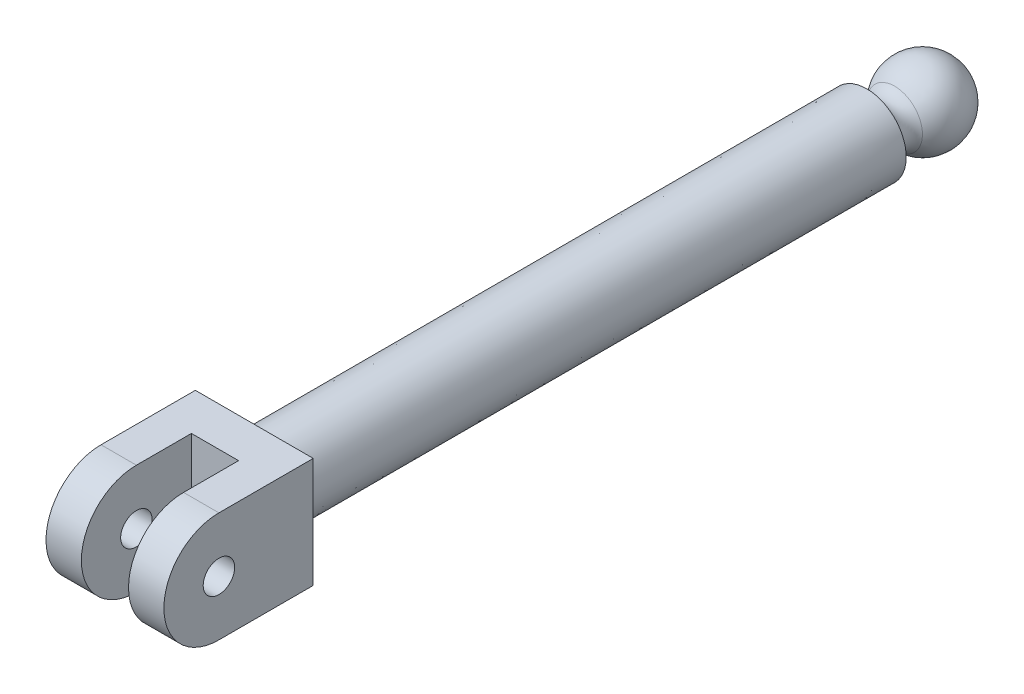
ISO-10303-21;
HEADER;
FILE_DESCRIPTION(('STEP AP214'),'2;1');
FILE_NAME('part.step','',(''),(''),'','','');
FILE_SCHEMA(('AUTOMOTIVE_DESIGN { 1 0 10303 214 1 1 1 1 }'));
ENDSEC;
DATA;
#1=APPLICATION_CONTEXT('core data for automotive mechanical design processes');
#2=APPLICATION_PROTOCOL_DEFINITION('international standard','automotive_design',2000,#1);
#3=PRODUCT_CONTEXT('',#1,'mechanical');
#4=PRODUCT('Part','Part','',(#3));
#5=PRODUCT_RELATED_PRODUCT_CATEGORY('part','',(#4));
#6=PRODUCT_DEFINITION_FORMATION('','',#4);
#7=PRODUCT_DEFINITION_CONTEXT('part definition',#1,'design');
#8=PRODUCT_DEFINITION('design','',#6,#7);
#9=PRODUCT_DEFINITION_SHAPE('','',#8);
#10=(LENGTH_UNIT() NAMED_UNIT(*) SI_UNIT(.MILLI.,.METRE.));
#11=(NAMED_UNIT(*) PLANE_ANGLE_UNIT() SI_UNIT($,.RADIAN.));
#12=(NAMED_UNIT(*) SI_UNIT($,.STERADIAN.) SOLID_ANGLE_UNIT());
#13=UNCERTAINTY_MEASURE_WITH_UNIT(LENGTH_MEASURE(1.E-05),#10,'distance_accuracy_value','');
#14=(GEOMETRIC_REPRESENTATION_CONTEXT(3) GLOBAL_UNCERTAINTY_ASSIGNED_CONTEXT((#13)) GLOBAL_UNIT_ASSIGNED_CONTEXT((#10,
#11,#12)) REPRESENTATION_CONTEXT('',''));
#15=CARTESIAN_POINT('',(0.,0.,0.));
#16=DIRECTION('',(0.,0.,1.));
#17=DIRECTION('',(1.,0.,0.));
#18=AXIS2_PLACEMENT_3D('',#15,#16,#17);
#19=CARTESIAN_POINT('',(-10.,0.,0.));
#20=DIRECTION('',(1.,0.,0.));
#21=DIRECTION('',(0.,0.,-1.));
#22=AXIS2_PLACEMENT_3D('',#19,#20,#21);
#23=CYLINDRICAL_SURFACE('',#22,7.);
#24=DIRECTION('',(1.,0.,0.));
#25=VECTOR('',#24,1.);
#26=CARTESIAN_POINT('',(-10.,-7.,0.));
#27=LINE('',#26,#25);
#28=CARTESIAN_POINT('',(-10.,-7.,0.));
#29=VERTEX_POINT('',#28);
#30=CARTESIAN_POINT('',(-5.5,-7.,0.));
#31=VERTEX_POINT('',#30);
#32=EDGE_CURVE('E123',#29,#31,#27,.T.);
#33=ORIENTED_EDGE('',*,*,#32,.T.);
#34=CARTESIAN_POINT('',(-5.5,0.,0.));
#35=DIRECTION('',(1.,0.,0.));
#36=DIRECTION('',(0.,0.,-1.));
#37=AXIS2_PLACEMENT_3D('',#34,#35,#36);
#38=CIRCLE('',#37,7.);
#39=CARTESIAN_POINT('',(-5.5,7.,0.));
#40=VERTEX_POINT('',#39);
#41=EDGE_CURVE('E106',#40,#31,#38,.T.);
#42=ORIENTED_EDGE('',*,*,#41,.F.);
#43=DIRECTION('',(1.,0.,0.));
#44=VECTOR('',#43,1.);
#45=CARTESIAN_POINT('',(-10.,7.,0.));
#46=LINE('',#45,#44);
#47=CARTESIAN_POINT('',(-10.,7.,0.));
#48=VERTEX_POINT('',#47);
#49=EDGE_CURVE('E132',#48,#40,#46,.T.);
#50=ORIENTED_EDGE('',*,*,#49,.F.);
#51=CARTESIAN_POINT('',(-10.,0.,0.));
#52=DIRECTION('',(1.,0.,0.));
#53=DIRECTION('',(0.,0.,-1.));
#54=AXIS2_PLACEMENT_3D('',#51,#52,#53);
#55=CIRCLE('',#54,7.);
#56=EDGE_CURVE('E131',#48,#29,#55,.T.);
#57=ORIENTED_EDGE('',*,*,#56,.T.);
#58=EDGE_LOOP('',(#33,#42,#50,#57));
#59=FACE_BOUND('',#58,.T.);
#60=ADVANCED_FACE('F35',(#59),#23,.T.);
#61=CARTESIAN_POINT('',(-10.,0.,0.));
#62=DIRECTION('',(1.,0.,0.));
#63=DIRECTION('',(0.,0.,-1.));
#64=AXIS2_PLACEMENT_3D('',#61,#62,#63);
#65=CYLINDRICAL_SURFACE('',#64,2.);
#66=CARTESIAN_POINT('',(-10.,0.,0.));
#67=DIRECTION('',(1.,0.,0.));
#68=DIRECTION('',(0.,0.,-1.));
#69=AXIS2_PLACEMENT_3D('',#66,#67,#68);
#70=CIRCLE('',#69,2.);
#71=CARTESIAN_POINT('',(-10.,0.,-2.));
#72=VERTEX_POINT('',#71);
#73=EDGE_CURVE('E135',#72,#72,#70,.T.);
#74=ORIENTED_EDGE('',*,*,#73,.F.);
#75=EDGE_LOOP('',(#74));
#76=FACE_BOUND('',#75,.T.);
#77=CARTESIAN_POINT('',(-5.5,0.,0.));
#78=DIRECTION('',(1.,0.,0.));
#79=DIRECTION('',(0.,0.,-1.));
#80=AXIS2_PLACEMENT_3D('',#77,#78,#79);
#81=CIRCLE('',#80,2.);
#82=CARTESIAN_POINT('',(-5.5,0.,-2.));
#83=VERTEX_POINT('',#82);
#84=EDGE_CURVE('E39',#83,#83,#81,.F.);
#85=ORIENTED_EDGE('',*,*,#84,.F.);
#86=EDGE_LOOP('',(#85));
#87=FACE_BOUND('',#86,.T.);
#88=ADVANCED_FACE('F215',(#76,#87),#65,.F.);
#89=CARTESIAN_POINT('',(5.,0.,0.));
#90=DIRECTION('',(-1.,0.,0.));
#91=DIRECTION('',(0.,0.,1.));
#92=AXIS2_PLACEMENT_3D('',#89,#90,#91);
#93=CYLINDRICAL_SURFACE('',#92,7.);
#94=CARTESIAN_POINT('',(0.5,0.,0.));
#95=DIRECTION('',(-1.,0.,0.));
#96=DIRECTION('',(0.,0.,1.));
#97=AXIS2_PLACEMENT_3D('',#94,#95,#96);
#98=CIRCLE('',#97,7.);
#99=CARTESIAN_POINT('',(0.5,-7.,0.));
#100=VERTEX_POINT('',#99);
#101=CARTESIAN_POINT('',(0.5,7.,0.));
#102=VERTEX_POINT('',#101);
#103=EDGE_CURVE('E51',#100,#102,#98,.T.);
#104=ORIENTED_EDGE('',*,*,#103,.F.);
#105=DIRECTION('',(-1.,0.,0.));
#106=VECTOR('',#105,1.);
#107=CARTESIAN_POINT('',(5.,-7.,0.));
#108=LINE('',#107,#106);
#109=CARTESIAN_POINT('',(5.,-7.,0.));
#110=VERTEX_POINT('',#109);
#111=EDGE_CURVE('E44',#110,#100,#108,.T.);
#112=ORIENTED_EDGE('',*,*,#111,.F.);
#113=CARTESIAN_POINT('',(5.,0.,0.));
#114=DIRECTION('',(1.,0.,0.));
#115=DIRECTION('',(0.,0.,-1.));
#116=AXIS2_PLACEMENT_3D('',#113,#114,#115);
#117=CIRCLE('',#116,7.);
#118=CARTESIAN_POINT('',(5.,7.,0.));
#119=VERTEX_POINT('',#118);
#120=EDGE_CURVE('E163',#119,#110,#117,.T.);
#121=ORIENTED_EDGE('',*,*,#120,.F.);
#122=DIRECTION('',(-1.,0.,0.));
#123=VECTOR('',#122,1.);
#124=CARTESIAN_POINT('',(5.,7.,0.));
#125=LINE('',#124,#123);
#126=EDGE_CURVE('E169',#119,#102,#125,.T.);
#127=ORIENTED_EDGE('',*,*,#126,.T.);
#128=EDGE_LOOP('',(#104,#112,#121,#127));
#129=FACE_BOUND('',#128,.T.);
#130=ADVANCED_FACE('F37',(#129),#93,.T.);
#131=CARTESIAN_POINT('',(5.,0.,0.));
#132=DIRECTION('',(-1.,0.,0.));
#133=DIRECTION('',(0.,0.,1.));
#134=AXIS2_PLACEMENT_3D('',#131,#132,#133);
#135=CYLINDRICAL_SURFACE('',#134,2.);
#136=CARTESIAN_POINT('',(5.,0.,0.));
#137=DIRECTION('',(1.,0.,0.));
#138=DIRECTION('',(0.,0.,-1.));
#139=AXIS2_PLACEMENT_3D('',#136,#137,#138);
#140=CIRCLE('',#139,2.);
#141=CARTESIAN_POINT('',(5.,0.,-2.));
#142=VERTEX_POINT('',#141);
#143=EDGE_CURVE('E160',#142,#142,#140,.T.);
#144=ORIENTED_EDGE('',*,*,#143,.T.);
#145=EDGE_LOOP('',(#144));
#146=FACE_BOUND('',#145,.T.);
#147=CARTESIAN_POINT('',(0.5,0.,0.));
#148=DIRECTION('',(-1.,0.,0.));
#149=DIRECTION('',(0.,0.,1.));
#150=AXIS2_PLACEMENT_3D('',#147,#148,#149);
#151=CIRCLE('',#150,2.);
#152=CARTESIAN_POINT('',(0.5,0.,2.));
#153=VERTEX_POINT('',#152);
#154=EDGE_CURVE('E180',#153,#153,#151,.T.);
#155=ORIENTED_EDGE('',*,*,#154,.T.);
#156=EDGE_LOOP('',(#155));
#157=FACE_BOUND('',#156,.T.);
#158=ADVANCED_FACE('F198',(#146,#157),#135,.F.);
#159=CARTESIAN_POINT('',(0.,0.,-7.));
#160=DIRECTION('',(0.,0.,-1.));
#161=DIRECTION('',(-1.,0.,0.));
#162=AXIS2_PLACEMENT_3D('',#159,#160,#161);
#163=PLANE('',#162);
#164=DIRECTION('',(-1.,0.,0.));
#165=VECTOR('',#164,1.);
#166=CARTESIAN_POINT('',(5.,7.,-7.));
#167=LINE('',#166,#165);
#168=CARTESIAN_POINT('',(0.5,7.,-7.));
#169=VERTEX_POINT('',#168);
#170=CARTESIAN_POINT('',(-5.5,7.,-7.));
#171=VERTEX_POINT('',#170);
#172=EDGE_CURVE('E143',#169,#171,#167,.T.);
#173=ORIENTED_EDGE('',*,*,#172,.T.);
#174=DIRECTION('',(0.,1.,0.));
#175=VECTOR('',#174,1.);
#176=CARTESIAN_POINT('',(-5.5,7.,-7.));
#177=LINE('',#176,#175);
#178=CARTESIAN_POINT('',(-5.5,-7.,-7.));
#179=VERTEX_POINT('',#178);
#180=EDGE_CURVE('E128',#179,#171,#177,.T.);
#181=ORIENTED_EDGE('',*,*,#180,.F.);
#182=DIRECTION('',(-1.,0.,0.));
#183=VECTOR('',#182,1.);
#184=CARTESIAN_POINT('',(5.,-7.,-7.));
#185=LINE('',#184,#183);
#186=CARTESIAN_POINT('',(0.5,-7.,-7.));
#187=VERTEX_POINT('',#186);
#188=EDGE_CURVE('E126',#187,#179,#185,.T.);
#189=ORIENTED_EDGE('',*,*,#188,.F.);
#190=DIRECTION('',(0.,-1.,0.));
#191=VECTOR('',#190,1.);
#192=CARTESIAN_POINT('',(0.5,7.,-7.));
#193=LINE('',#192,#191);
#194=EDGE_CURVE('E259',#169,#187,#193,.T.);
#195=ORIENTED_EDGE('',*,*,#194,.F.);
#196=EDGE_LOOP('',(#173,#181,#189,#195));
#197=FACE_BOUND('',#196,.T.);
#198=ADVANCED_FACE('F194',(#197),#163,.F.);
#199=CARTESIAN_POINT('',(5.,0.,0.));
#200=DIRECTION('',(1.,0.,0.));
#201=DIRECTION('',(0.,0.,-1.));
#202=AXIS2_PLACEMENT_3D('',#199,#200,#201);
#203=PLANE('',#202);
#204=ORIENTED_EDGE('',*,*,#120,.T.);
#205=DIRECTION('',(0.,0.,-1.));
#206=VECTOR('',#205,1.);
#207=CARTESIAN_POINT('',(5.,-7.,-7.));
#208=LINE('',#207,#206);
#209=CARTESIAN_POINT('',(5.,-7.,-12.));
#210=VERTEX_POINT('',#209);
#211=EDGE_CURVE('E166',#110,#210,#208,.T.);
#212=ORIENTED_EDGE('',*,*,#211,.T.);
#213=DIRECTION('',(0.,-1.,0.));
#214=VECTOR('',#213,1.);
#215=CARTESIAN_POINT('',(5.,7.,-12.));
#216=LINE('',#215,#214);
#217=CARTESIAN_POINT('',(5.,7.,-12.));
#218=VERTEX_POINT('',#217);
#219=EDGE_CURVE('E139',#218,#210,#216,.T.);
#220=ORIENTED_EDGE('',*,*,#219,.F.);
#221=DIRECTION('',(0.,0.,1.));
#222=VECTOR('',#221,1.);
#223=CARTESIAN_POINT('',(5.,7.,0.));
#224=LINE('',#223,#222);
#225=EDGE_CURVE('E59',#218,#119,#224,.T.);
#226=ORIENTED_EDGE('',*,*,#225,.T.);
#227=EDGE_LOOP('',(#204,#212,#220,#226));
#228=FACE_BOUND('',#227,.T.);
#229=ORIENTED_EDGE('',*,*,#143,.F.);
#230=EDGE_LOOP('',(#229));
#231=FACE_BOUND('',#230,.T.);
#232=ADVANCED_FACE('F197',(#228,#231),#203,.T.);
#233=CARTESIAN_POINT('',(5.,-7.,-7.));
#234=DIRECTION('',(0.,1.,0.));
#235=DIRECTION('',(0.,0.,1.));
#236=AXIS2_PLACEMENT_3D('',#233,#234,#235);
#237=PLANE('',#236);
#238=ORIENTED_EDGE('',*,*,#188,.T.);
#239=DIRECTION('',(0.,0.,-1.));
#240=VECTOR('',#239,1.);
#241=CARTESIAN_POINT('',(-5.5,-7.,-7.));
#242=LINE('',#241,#240);
#243=EDGE_CURVE('E111',#31,#179,#242,.T.);
#244=ORIENTED_EDGE('',*,*,#243,.F.);
#245=ORIENTED_EDGE('',*,*,#32,.F.);
#246=DIRECTION('',(0.,0.,1.));
#247=VECTOR('',#246,1.);
#248=CARTESIAN_POINT('',(-10.,-7.,-12.));
#249=LINE('',#248,#247);
#250=CARTESIAN_POINT('',(-10.,-7.,-12.));
#251=VERTEX_POINT('',#250);
#252=EDGE_CURVE('E164',#251,#29,#249,.T.);
#253=ORIENTED_EDGE('',*,*,#252,.F.);
#254=DIRECTION('',(-1.,0.,0.));
#255=VECTOR('',#254,1.);
#256=CARTESIAN_POINT('',(5.,-7.,-12.));
#257=LINE('',#256,#255);
#258=EDGE_CURVE('E142',#210,#251,#257,.T.);
#259=ORIENTED_EDGE('',*,*,#258,.F.);
#260=ORIENTED_EDGE('',*,*,#211,.F.);
#261=ORIENTED_EDGE('',*,*,#111,.T.);
#262=DIRECTION('',(0.,0.,1.));
#263=VECTOR('',#262,1.);
#264=CARTESIAN_POINT('',(0.5,-7.,-7.));
#265=LINE('',#264,#263);
#266=EDGE_CURVE('E257',#187,#100,#265,.T.);
#267=ORIENTED_EDGE('',*,*,#266,.F.);
#268=EDGE_LOOP('',(#238,#244,#245,#253,#259,#260,#261,#267));
#269=FACE_BOUND('',#268,.T.);
#270=ADVANCED_FACE('F121',(#269),#237,.F.);
#271=CARTESIAN_POINT('',(5.,7.,0.));
#272=DIRECTION('',(0.,-1.,0.));
#273=DIRECTION('',(0.,0.,-1.));
#274=AXIS2_PLACEMENT_3D('',#271,#272,#273);
#275=PLANE('',#274);
#276=DIRECTION('',(0.,0.,1.));
#277=VECTOR('',#276,1.);
#278=CARTESIAN_POINT('',(-5.5,7.,0.));
#279=LINE('',#278,#277);
#280=EDGE_CURVE('E113',#171,#40,#279,.T.);
#281=ORIENTED_EDGE('',*,*,#280,.F.);
#282=ORIENTED_EDGE('',*,*,#172,.F.);
#283=DIRECTION('',(0.,0.,-1.));
#284=VECTOR('',#283,1.);
#285=CARTESIAN_POINT('',(0.5,7.,-7.));
#286=LINE('',#285,#284);
#287=EDGE_CURVE('E262',#102,#169,#286,.T.);
#288=ORIENTED_EDGE('',*,*,#287,.F.);
#289=ORIENTED_EDGE('',*,*,#126,.F.);
#290=ORIENTED_EDGE('',*,*,#225,.F.);
#291=DIRECTION('',(-1.,0.,0.));
#292=VECTOR('',#291,1.);
#293=CARTESIAN_POINT('',(5.,7.,-12.));
#294=LINE('',#293,#292);
#295=CARTESIAN_POINT('',(-10.,7.,-12.));
#296=VERTEX_POINT('',#295);
#297=EDGE_CURVE('E148',#218,#296,#294,.T.);
#298=ORIENTED_EDGE('',*,*,#297,.T.);
#299=DIRECTION('',(0.,0.,1.));
#300=VECTOR('',#299,1.);
#301=CARTESIAN_POINT('',(-10.,7.,-12.));
#302=LINE('',#301,#300);
#303=EDGE_CURVE('E151',#296,#48,#302,.T.);
#304=ORIENTED_EDGE('',*,*,#303,.T.);
#305=ORIENTED_EDGE('',*,*,#49,.T.);
#306=EDGE_LOOP('',(#281,#282,#288,#289,#290,#298,#304,#305));
#307=FACE_BOUND('',#306,.T.);
#308=ADVANCED_FACE('F202',(#307),#275,.F.);
#309=CARTESIAN_POINT('',(-10.,7.,-12.));
#310=DIRECTION('',(-1.,0.,0.));
#311=DIRECTION('',(0.,-1.,0.));
#312=AXIS2_PLACEMENT_3D('',#309,#310,#311);
#313=PLANE('',#312);
#314=ORIENTED_EDGE('',*,*,#252,.T.);
#315=ORIENTED_EDGE('',*,*,#56,.F.);
#316=ORIENTED_EDGE('',*,*,#303,.F.);
#317=DIRECTION('',(0.,-1.,0.));
#318=VECTOR('',#317,1.);
#319=CARTESIAN_POINT('',(-10.,7.,-12.));
#320=LINE('',#319,#318);
#321=EDGE_CURVE('E145',#296,#251,#320,.T.);
#322=ORIENTED_EDGE('',*,*,#321,.T.);
#323=EDGE_LOOP('',(#314,#315,#316,#322));
#324=FACE_BOUND('',#323,.T.);
#325=ORIENTED_EDGE('',*,*,#73,.T.);
#326=EDGE_LOOP('',(#325));
#327=FACE_BOUND('',#326,.T.);
#328=ADVANCED_FACE('F192',(#324,#327),#313,.T.);
#329=CARTESIAN_POINT('',(0.,0.,-12.));
#330=DIRECTION('',(0.,0.,-1.));
#331=DIRECTION('',(-1.,0.,0.));
#332=AXIS2_PLACEMENT_3D('',#329,#330,#331);
#333=PLANE('',#332);
#334=CARTESIAN_POINT('',(-2.5,5.,-12.));
#335=CARTESIAN_POINT('',(-2.44545845039604,5.00000034303338,-12.0000000000417));
#336=CARTESIAN_POINT('',(-2.39091692024258,4.99910757843501,-11.9999999354703));
#337=CARTESIAN_POINT('',(-2.28189225395653,4.99553829640775,-11.9999996774008));
#338=CARTESIAN_POINT('',(-2.22740911782394,4.99286177897884,-11.9999994839027));
#339=CARTESIAN_POINT('',(-2.1185595946995,4.98572745372337,-11.999998968279));
#340=CARTESIAN_POINT('',(-2.06419320770765,4.98126964589678,-11.9999986461535));
#341=CARTESIAN_POINT('',(-1.95563539621187,4.97057762153549,-11.9999978738687));
#342=CARTESIAN_POINT('',(-1.90144397170794,4.96434340500073,-11.9999974237094));
#343=CARTESIAN_POINT('',(-1.79329411567039,4.95010520999742,-11.9999963961651));
#344=CARTESIAN_POINT('',(-1.73933568413678,4.94210123152878,-11.9999958187801));
#345=CARTESIAN_POINT('',(-1.63170959382462,4.92433209128339,-11.9999945378275));
#346=CARTESIAN_POINT('',(-1.57804193504609,4.91456692950655,-11.9999938342599));
#347=CARTESIAN_POINT('',(-1.47105485898445,4.89328587734348,-11.9999923022132));
#348=CARTESIAN_POINT('',(-1.41773544170135,4.88176998695715,-11.9999914737341));
#349=CARTESIAN_POINT('',(-1.31150194437886,4.85699980963608,-11.9999896933639));
#350=CARTESIAN_POINT('',(-1.25858786433949,4.84374552270122,-11.9999887414727));
#351=CARTESIAN_POINT('',(-1.15322170323062,4.81551274515564,-11.999986716004));
#352=CARTESIAN_POINT('',(-1.10076962216114,4.80053425454479,-11.9999856424265));
#353=CARTESIAN_POINT('',(-0.996383625991973,4.7688691090296,-11.9999833755351));
#354=CARTESIAN_POINT('',(-0.94444971089232,4.75218245412513,-11.9999821822213));
#355=CARTESIAN_POINT('',(-0.841155658799293,4.71711884849937,-11.9999796780301));
#356=CARTESIAN_POINT('',(-0.789795521805972,4.69874189777794,-11.9999783671526));
#357=CARTESIAN_POINT('',(-0.68770402364572,4.66031737901959,-11.9999756302266));
#358=CARTESIAN_POINT('',(-0.636972662478852,4.6402698109825,-11.9999742041781));
#359=CARTESIAN_POINT('',(-0.536193040382862,4.5985255250293,-11.9999712395202));
#360=CARTESIAN_POINT('',(-0.486144779453814,4.57682880711301,-11.9999697009107));
#361=CARTESIAN_POINT('',(-0.38678495076397,4.53180945478979,-11.9999665139558));
#362=CARTESIAN_POINT('',(-0.33747338300326,4.50848682038267,-11.9999648656104));
#363=CARTESIAN_POINT('',(-0.239639744711144,4.46024060953796,-11.99996146222));
#364=CARTESIAN_POINT('',(-0.191117674179837,4.43531703310016,-11.999959707175));
#365=CARTESIAN_POINT('',(-0.0949149889942001,4.3838956269831,-11.9999560936306));
#366=CARTESIAN_POINT('',(-0.0472343743399836,4.35739779730362,-11.9999542351312));
#367=CARTESIAN_POINT('',(0.0472343414957913,4.30285625924192,-11.9999504181277));
#368=CARTESIAN_POINT('',(0.0940224426772208,4.27481255085947,-11.9999484596237));
#369=CARTESIAN_POINT('',(0.186656029697485,4.21720928529615,-11.9999444462624));
#370=CARTESIAN_POINT('',(0.232501515536174,4.18764972811504,-11.9999423914051));
#371=CARTESIAN_POINT('',(0.323200779377098,4.12704641806751,-11.9999381891857));
#372=CARTESIAN_POINT('',(0.368054557379171,4.09600266520084,-11.9999360418236));
#373=CARTESIAN_POINT('',(0.456722374998553,4.03246420620918,-11.9999316586366));
#374=CARTESIAN_POINT('',(0.500536414615683,3.99996950008394,-11.9999294228116));
#375=CARTESIAN_POINT('',(0.587077838294729,3.93356393071913,-11.9999248669294));
#376=CARTESIAN_POINT('',(0.629805222356448,3.89965306747932,-11.9999225468722));
#377=CARTESIAN_POINT('',(0.714127581372164,3.83045149648587,-11.9999178269408));
#378=CARTESIAN_POINT('',(0.755722556325945,3.79516078873197,-11.9999154270665));
#379=CARTESIAN_POINT('',(0.837735556185265,3.72323731888285,-11.9999105520956));
#380=CARTESIAN_POINT('',(0.878153581090569,3.68660455678735,-11.9999080769991));
#381=CARTESIAN_POINT('',(0.957769400219954,3.61203620553291,-11.9999030563531));
#382=CARTESIAN_POINT('',(0.996967194443782,3.57410061637369,-11.9999005108037));
#383=CARTESIAN_POINT('',(1.07410057823076,3.49696723336945,-11.9998953541912));
#384=CARTESIAN_POINT('',(1.11203616779364,3.45776943952416,-11.9998927431281));
#385=CARTESIAN_POINT('',(1.18660451987959,3.37815362112582,-11.9998874605916));
#386=CARTESIAN_POINT('',(1.22323728240236,3.33773559657249,-11.9998847891183));
#387=CARTESIAN_POINT('',(1.29516075312872,3.25572259738967,-11.9998793910237));
#388=CARTESIAN_POINT('',(1.33045146133199,3.21412762275989,-11.9998766644025));
#389=CARTESIAN_POINT('',(1.39965303324531,3.12980526436334,-11.9998711614276));
#390=CARTESIAN_POINT('',(1.43356389695503,3.08707788059629,-11.999868385074));
#391=CARTESIAN_POINT('',(1.49996946727917,3.0005364574764,-11.9998627881974));
#392=CARTESIAN_POINT('',(1.53246417389325,2.95672241812329,-11.9998599676745));
#393=CARTESIAN_POINT('',(1.5960026338805,2.86805460100049,-11.9998542881637));
#394=CARTESIAN_POINT('',(1.6270463872533,2.82320082323053,-11.9998514291759));
#395=CARTESIAN_POINT('',(1.68764969832937,2.73250155982113,-11.9998456785753));
#396=CARTESIAN_POINT('',(1.71720925603225,2.68665607418143,-11.9998427869624));
#397=CARTESIAN_POINT('',(1.77481252265374,2.59402248752526,-11.9998369770807));
#398=CARTESIAN_POINT('',(1.80285623157191,2.54723438650854,-11.9998340588118));
#399=CARTESIAN_POINT('',(1.857397770718,2.45276567096717,-11.9998282017097));
#400=CARTESIAN_POINT('',(1.88389560094546,2.40508505644228,-11.9998252628765));
#401=CARTESIAN_POINT('',(1.93531700816969,2.30888237147922,-11.9998193708536));
#402=CARTESIAN_POINT('',(1.96024058516599,2.2603603010408,-11.999816417664));
#403=CARTESIAN_POINT('',(2.00848679713721,2.16252666289739,-11.9998105032457));
#404=CARTESIAN_POINT('',(2.03180943211164,2.11321509519216,-11.999807542017));
#405=CARTESIAN_POINT('',(2.07682878557716,2.01385526657525,-11.9998016179409));
#406=CARTESIAN_POINT('',(2.09852550406774,1.96380700566334,-11.9997986550935));
#407=CARTESIAN_POINT('',(2.14026979117566,1.86302738356272,-11.9997927342961));
#408=CARTESIAN_POINT('',(2.16031735979247,1.8122960223738,-11.9997897763461));
#409=CARTESIAN_POINT('',(2.19874187971386,1.71020452412968,-11.9997838719486));
#410=CARTESIAN_POINT('',(2.21711883101789,1.65884438707428,-11.9997809255011));
#411=CARTESIAN_POINT('',(2.25218243781355,1.55555033481669,-11.9997750507957));
#412=CARTESIAN_POINT('',(2.2688690933046,1.5036164196143,-11.9997721225377));
#413=CARTESIAN_POINT('',(2.30053423998514,1.3992304231982,-11.9997662909728));
#414=CARTESIAN_POINT('',(2.31551273117403,1.34677834198432,-11.999763387666));
#415=CARTESIAN_POINT('',(2.34374550990616,1.24141218054585,-11.9997576128326));
#416=CARTESIAN_POINT('',(2.35699979744878,1.1884981003211,-11.999754741306));
#417=CARTESIAN_POINT('',(2.38176997586466,1.08226460258164,-11.9997490369224));
#418=CARTESIAN_POINT('',(2.39328586673728,1.02894518506678,-11.9997462040654));
#419=CARTESIAN_POINT('',(2.41456692030808,0.921958108513153,-11.9997405839631));
#420=CARTESIAN_POINT('',(2.4243320830056,0.86829044947426,-11.9997377967177));
#421=CARTESIAN_POINT('',(2.44210122344465,0.760664358544387,-11.999732274826));
#422=CARTESIAN_POINT('',(2.4501052011855,0.706705926653294,-11.9997295401796));
#423=CARTESIAN_POINT('',(2.46434340085055,0.598556070057702,-11.9997241305112));
#424=CARTESIAN_POINT('',(2.47057762277404,0.544364645353109,-11.9997214554891));
#425=CARTESIAN_POINT('',(2.48126963504253,0.435806832663745,-11.9997161721248));
#426=CARTESIAN_POINT('',(2.48572742538681,0.381440444678903,-11.9997135637826));
#427=CARTESIAN_POINT('',(2.49286180098235,0.272590922317351,-11.9997084208564));
#428=CARTESIAN_POINT('',(2.49553838623289,0.218107787940592,-11.9997058862725));
#429=CARTESIAN_POINT('',(2.49910748548544,0.109083114698495,-11.9997008979564));
#430=CARTESIAN_POINT('',(2.4999999994867,0.0545415758331311,-11.9996984442242));
#431=CARTESIAN_POINT('',(2.5000000005133,-0.0545415019418793,-11.9996936247129));
#432=CARTESIAN_POINT('',(2.49910748753786,-0.109083040851526,-11.9996912589337));
#433=CARTESIAN_POINT('',(2.49553839033521,-0.218107714270732,-11.9996866224296));
#434=CARTESIAN_POINT('',(2.49286180610721,-0.272590848780266,-11.9996843517046));
#435=CARTESIAN_POINT('',(2.48572743255167,-0.381440371495748,-11.9996799124023));
#436=CARTESIAN_POINT('',(2.48126964322334,-0.435806759701644,-11.999677743825));
#437=CARTESIAN_POINT('',(2.47057763297841,-0.544364572921185,-11.9996735158966));
#438=CARTESIAN_POINT('',(2.46434341206098,-0.598555997934751,-11.9996714565455));
#439=CARTESIAN_POINT('',(2.45010521439649,-0.706705855235905,-11.9996674541248));
#440=CARTESIAN_POINT('',(2.44210123764859,-0.760664287523386,-11.9996655110554));
#441=CARTESIAN_POINT('',(2.42433209918058,-0.868290379333061,-11.9996617482234));
#442=CARTESIAN_POINT('',(2.41456693745964,-0.921958038855116,-11.9996599284609));
#443=CARTESIAN_POINT('',(2.39328588582394,-1.02894511646135,-11.9996564192302));
#444=CARTESIAN_POINT('',(2.38176999590832,-1.08226453454536,-11.9996547297621));
#445=CARTESIAN_POINT('',(2.3569998193852,-1.18849803350853,-11.9996514880622));
#446=CARTESIAN_POINT('',(2.34374553277684,-1.24141211438749,-11.9996499358304));
#447=CARTESIAN_POINT('',(2.31551275588882,-1.34677827721878,-11.9996469754926));
#448=CARTESIAN_POINT('',(2.30053426560829,-1.39923035917088,-11.9996455673865));
#449=CARTESIAN_POINT('',(2.268869120717,-1.50361635714665,-11.9996429021293));
#450=CARTESIAN_POINT('',(2.25218246610536,-1.55555027317005,-11.9996416449781));
#451=CARTESIAN_POINT('',(2.21711886103796,-1.65884432715162,-11.9996392883921));
#452=CARTESIAN_POINT('',(2.19874191058132,-1.7102044651095,-11.9996381889574));
#453=CARTESIAN_POINT('',(2.16031739232118,-1.81229596523911,-11.9996361544914));
#454=CARTESIAN_POINT('',(2.14026982451679,-1.86302732741052,-11.9996352194601));
#455=CARTESIAN_POINT('',(2.09852553899722,-1.96380695155508,-11.9996335204062));
#456=CARTESIAN_POINT('',(2.07682882128115,-2.01385521352787,-11.9996327563835));
#457=CARTESIAN_POINT('',(2.03180946932532,-2.11321504434385,-11.9996314058628));
#458=CARTESIAN_POINT('',(2.00848683508467,-2.16252661318664,-11.9996308193648));
#459=CARTESIAN_POINT('',(1.96024062453886,-2.26036025368068,-11.9996298303138));
#460=CARTESIAN_POINT('',(1.93531704823281,-2.30888232533148,-11.9996294277608));
#461=CARTESIAN_POINT('',(1.88389564234424,-2.4050850127929,-11.9996288129172));
#462=CARTESIAN_POINT('',(1.85739781276081,-2.45276562860304,-11.9996286006266));
#463=CARTESIAN_POINT('',(1.80285627485533,-2.54723434678644,-11.9996283725158));
#464=CARTESIAN_POINT('',(1.77481256653237,-2.59402244915918,-11.9996283566955));
#465=CARTESIAN_POINT('',(1.71720930105129,-2.68665603859676,-11.999628527617));
#466=CARTESIAN_POINT('',(1.68764974389228,-2.73250152566104,-11.9996287143588));
#467=CARTESIAN_POINT('',(1.62704643385145,-2.8232007919867,-11.9996292963733));
#468=CARTESIAN_POINT('',(1.59600268096875,-2.86805457124749,-11.999629691646));
#469=CARTESIAN_POINT('',(1.53246422190683,-2.95672239141667,-11.9996306965624));
#470=CARTESIAN_POINT('',(1.49996951572673,-3.00053643232443,-11.999631306206));
#471=CARTESIAN_POINT('',(1.43356394621344,-3.08707785861586,-11.9996327455685));
#472=CARTESIAN_POINT('',(1.39965308287936,-3.12980524399886,-11.9996335752874));
#473=CARTESIAN_POINT('',(1.33045151165805,-3.21412760568696,-11.9996354603636));
#474=CARTESIAN_POINT('',(1.29516080376996,-3.25572258199136,-11.9996365157209));
#475=CARTESIAN_POINT('',(1.22323733361263,-3.33773558458039,-11.9996388574893));
#476=CARTESIAN_POINT('',(1.18660457134256,-3.37815361086428,-11.9996401439004));
#477=CARTESIAN_POINT('',(1.11203621969876,-3.45776943277793,-11.9996429530389));
#478=CARTESIAN_POINT('',(1.07410063032419,-3.49696722840692,-11.9996444757663));
#479=CARTESIAN_POINT('',(0.99696724684878,-3.57410061502987,-11.9996477626408));
#480=CARTESIAN_POINT('',(0.957769452747107,-3.61203620602302,-11.9996495267878));
#481=CARTESIAN_POINT('',(0.878153633795271,-3.68660456099369,-11.9996533014407));
#482=CARTESIAN_POINT('',(0.837735608944305,-3.72323732497035,-11.9996553119465));
#483=CARTESIAN_POINT('',(0.755722609125323,-3.79516079862717,-11.9996595840865));
#484=CARTESIAN_POINT('',(0.714127634156522,-3.83045150830643,-11.9996618457207));
#485=CARTESIAN_POINT('',(0.629805275040986,-3.89965308319286,-11.999666624712));
#486=CARTESIAN_POINT('',(0.587077890893484,-3.93356394839909,-11.9996691420693));
#487=CARTESIAN_POINT('',(0.50053646697178,-3.99996952173582,-11.9996744369218));
#488=CARTESIAN_POINT('',(0.456722427196832,-4.03246422986534,-11.9996772144172));
#489=CARTESIAN_POINT('',(0.368054609189537,-4.09600269290141,-11.9996830337769));
#490=CARTESIAN_POINT('',(0.323200830956468,-4.12704644780695,-11.9996860756412));
#491=CARTESIAN_POINT('',(0.232501566580229,-4.18764976196481,-11.9996924277805));
#492=CARTESIAN_POINT('',(0.186656080436362,-4.21720932121608,-11.9996957380555));
#493=CARTESIAN_POINT('',(0.0940224927315139,-4.27481259094895,-11.9997026308648));
#494=CARTESIAN_POINT('',(0.0472343911698613,-4.30285630142948,-11.9997062133991));
#495=CARTESIAN_POINT('',(-0.0472343255013552,-4.35739784371318,-11.9997136543783));
#496=CARTESIAN_POINT('',(-0.094914940611563,-4.38389567551524,-11.9997175128232));
#497=CARTESIAN_POINT('',(-0.191117626784811,-4.43531708589989,-11.9997255090734));
#498=CARTESIAN_POINT('',(-0.239639697848467,-4.46024066448132,-11.9997296468787));
#499=CARTESIAN_POINT('',(-0.337473337281354,-4.50848687963228,-11.9997382050949));
#500=CARTESIAN_POINT('',(-0.386784905651169,-4.53180951620062,-11.9997426255057));
#501=CARTESIAN_POINT('',(-0.486144735635759,-4.57682887286171,-11.9997517519694));
#502=CARTESIAN_POINT('',(-0.536192997251085,-4.59852559295324,-11.9997564580223));
#503=CARTESIAN_POINT('',(-0.636972620795873,-4.64026988326904,-11.9997661585947));
#504=CARTESIAN_POINT('',(-0.687703982725853,-4.66031745349207,-11.9997711531142));
#505=CARTESIAN_POINT('',(-0.789795482490393,-4.69874197663007,-11.9997814332313));
#506=CARTESIAN_POINT('',(-0.841155620325434,-4.71711892954377,-11.9997867188289));
#507=CARTESIAN_POINT('',(-0.9444496741732,-4.75218253956135,-11.9997975834898));
#508=CARTESIAN_POINT('',(-0.99638359018637,-4.76886919666392,-11.9998031625531));
#509=CARTESIAN_POINT('',(-1.10076958827844,-4.80053434656763,-11.9998146163368));
#510=CARTESIAN_POINT('',(-1.15322167035774,-4.81551283936744,-11.9998204910572));
#511=CARTESIAN_POINT('',(-1.25858783348907,-4.84374562132229,-11.9998325380347));
#512=CARTESIAN_POINT('',(-1.31150191454146,-4.85699991047596,-11.9998387102916));
#513=CARTESIAN_POINT('',(-1.41773541423805,-4.88177009210364,-11.9998513543322));
#514=CARTESIAN_POINT('',(-1.47105483288256,-4.89328598457625,-11.9998578261157));
#515=CARTESIAN_POINT('',(-1.57804191072376,-4.91456704137013,-11.9998710697221));
#516=CARTESIAN_POINT('',(-1.63170956992073,-4.92433220568999,-11.9998778415449));
#517=CARTESIAN_POINT('',(-1.73933566494227,-4.94210134926377,-11.9998916901834));
#518=CARTESIAN_POINT('',(-1.79329410076707,-4.95010532851624,-11.9998987669991));
#519=CARTESIAN_POINT('',(-1.90144395128251,-4.96434353158288,-11.9999132129233));
#520=CARTESIAN_POINT('',(-1.95563536597335,-4.97057775539558,-11.9999205820318));
#521=CARTESIAN_POINT('',(-2.06419321082454,-4.98126976999024,-11.9999356646397));
#522=CARTESIAN_POINT('',(-2.11855964098505,-4.98572756077071,-11.999943378139));
#523=CARTESIAN_POINT('',(-2.22740905305406,-4.99286194261007,-11.9999589587058));
#524=CARTESIAN_POINT('',(-2.28189203496266,-4.99553853366745,-11.9999668257732));
#525=CARTESIAN_POINT('',(-2.39091712981141,-4.99910762443085,-11.9999834281509));
#526=CARTESIAN_POINT('',(-2.44545924275161,-5.00000012413533,-11.9999921634611));
#527=CARTESIAN_POINT('',(-2.53796650304802,-5.00000016432768,-12.0000054551126));
#528=CARTESIAN_POINT('',(-2.57593234916492,-4.99956771138865,-12.0000104747053));
#529=CARTESIAN_POINT('',(-2.65802713837808,-4.9976972758614,-12.0000194488151));
#530=CARTESIAN_POINT('',(-2.70215272761432,-4.99610698982593,-12.0000230966968));
#531=CARTESIAN_POINT('',(-2.79652269504382,-4.99145363470804,-12.0000297581385));
#532=CARTESIAN_POINT('',(-2.84675847446358,-4.98821548505753,-12.0000326112974));
#533=CARTESIAN_POINT('',(-2.9532738865472,-4.97973278335951,-12.0000375449992));
#534=CARTESIAN_POINT('',(-3.00953784884307,-4.9742906166354,-12.0000394875677));
#535=CARTESIAN_POINT('',(-3.12799319365028,-4.96080211717575,-12.000042687416));
#536=CARTESIAN_POINT('',(-3.19015961796522,-4.95253601571105,-12.0000438464706));
#537=CARTESIAN_POINT('',(-3.32025121264998,-4.93274109827475,-12.0000455176224));
#538=CARTESIAN_POINT('',(-3.38813973581393,-4.92097092125245,-12.0000459546506));
#539=CARTESIAN_POINT('',(-3.52944233865402,-4.89345333410699,-12.0000462544501));
#540=CARTESIAN_POINT('',(-3.60280544173742,-4.87744376311151,-12.0000460621568));
#541=CARTESIAN_POINT('',(-3.75474722162242,-4.84068310430038,-12.0000451799211));
#542=CARTESIAN_POINT('',(-3.8332578112122,-4.81965009849919,-12.0000444502961));
#543=CARTESIAN_POINT('',(-3.99509199488035,-4.7720380613567,-12.0000425801897));
#544=CARTESIAN_POINT('',(-4.07832725528155,-4.7451588063702,-12.0000414126704));
#545=CARTESIAN_POINT('',(-4.24911163464249,-4.68501586837354,-12.0000387591301));
#546=CARTESIAN_POINT('',(-4.33654964309696,-4.65143514477253,-12.0000372564258));
#547=CARTESIAN_POINT('',(-4.46831964287047,-4.59653503345036,-12.0000348738306));
#548=CARTESIAN_POINT('',(-4.51339159203401,-4.57697170025977,-12.000034037296));
#549=CARTESIAN_POINT('',(-4.60434971891063,-4.53588814538322,-12.0000323194272));
#550=CARTESIAN_POINT('',(-4.65021689251384,-4.51432571862617,-12.0000314375117));
#551=CARTESIAN_POINT('',(-4.74266306395862,-4.4691376278173,-12.0000296417549));
#552=CARTESIAN_POINT('',(-4.78922109371155,-4.44546908960804,-12.0000287277605));
#553=CARTESIAN_POINT('',(-4.88293992540245,-4.39596288152918,-12.0000268803161));
#554=CARTESIAN_POINT('',(-4.93007777294068,-4.37008174130088,-12.0000259470912));
#555=CARTESIAN_POINT('',(-5.02483710128675,-4.31604664646557,-12.0000240735209));
#556=CARTESIAN_POINT('',(-5.07243352274537,-4.28784874032178,-12.0000231337422));
#557=CARTESIAN_POINT('',(-5.1679813331824,-4.22907909754317,-12.0000212590696));
#558=CARTESIAN_POINT('',(-5.21590546814191,-4.19846304307121,-12.0000203250463));
#559=CARTESIAN_POINT('',(-5.31196999851521,-4.13475964423136,-12.0000184734873));
#560=CARTESIAN_POINT('',(-5.3600808512942,-4.10162774230796,-12.0000175570903));
#561=CARTESIAN_POINT('',(-5.45636991083736,-4.03279958414168,-12.0000157518696));
#562=CARTESIAN_POINT('',(-5.50451619817097,-3.99705866598983,-12.0000148644177));
#563=CARTESIAN_POINT('',(-5.60071682693246,-3.92292472840967,-12.0000131275445));
#564=CARTESIAN_POINT('',(-5.64873678805083,-3.88448708790529,-12.0000122796938));
#565=CARTESIAN_POINT('',(-5.74451495972352,-3.80487824371106,-12.0000106317317));
#566=CARTESIAN_POINT('',(-5.79223625066613,-3.7636626146844,-12.000009833356));
#567=CARTESIAN_POINT('',(-5.88723672000653,-3.6784236383354,-12.0000082931782));
#568=CARTESIAN_POINT('',(-5.93447636747476,-3.63435622617774,-12.0000075532433));
#569=CARTESIAN_POINT('',(-6.02832265306461,-3.54334790591414,-12.0000061377761));
#570=CARTESIAN_POINT('',(-6.07488708436034,-3.49636346808281,-12.0000054642088));
#571=CARTESIAN_POINT('',(-6.16718160890082,-3.39946481362373,-12.0000041881628));
#572=CARTESIAN_POINT('',(-6.21286676329248,-3.34950778677507,-12.0000035877136));
#573=CARTESIAN_POINT('',(-6.3031911653836,-3.24661832616403,-12.0000024633049));
#574=CARTESIAN_POINT('',(-6.34778269558846,-3.19364399572,-12.0000019414055));
#575=CARTESIAN_POINT('',(-6.43569832961493,-3.08468615233208,-12.0000009780663));
#576=CARTESIAN_POINT('',(-6.47897190130412,-3.0286618596894,-12.0000005386832));
#577=CARTESIAN_POINT('',(-6.56402054151422,-2.91358339877935,-11.9999997427645));
#578=CARTESIAN_POINT('',(-6.6057422390217,-2.85448978032193,-11.9999993882479));
#579=CARTESIAN_POINT('',(-6.68744700404759,-2.73326631244649,-11.9999987627151));
#580=CARTESIAN_POINT('',(-6.72737385034247,-2.67109856352667,-11.9999984936456));
#581=CARTESIAN_POINT('',(-6.80524036415627,-2.54373609008034,-11.999998037769));
#582=CARTESIAN_POINT('',(-6.8431209630073,-2.47850524603483,-11.9999978528012));
#583=CARTESIAN_POINT('',(-6.9166387679217,-2.34504272996828,-11.9999975618436));
#584=CARTESIAN_POINT('',(-6.95221407592575,-2.27677695516615,-11.9999974575503));
#585=CARTESIAN_POINT('',(-7.0208583126114,-2.13728889749761,-11.9999973224528));
#586=CARTESIAN_POINT('',(-7.05386254837736,-2.06603477202175,-11.9999972931667));
#587=CARTESIAN_POINT('',(-7.11709591702938,-1.9206337729882,-11.999997300241));
#588=CARTESIAN_POINT('',(-7.14725761434906,-1.84645756620616,-11.9999973379052));
#589=CARTESIAN_POINT('',(-7.20453262988267,-1.69529684509722,-11.9999974685129));
#590=CARTESIAN_POINT('',(-7.23157584092295,-1.61828576083817,-11.9999975625097));
#591=CARTESIAN_POINT('',(-7.28233739408156,-1.46156161517382,-11.9999977928182));
#592=CARTESIAN_POINT('',(-7.30598304844615,-1.3818250046933,-11.9999979298977));
#593=CARTESIAN_POINT('',(-7.34967128129767,-1.2197791519912,-11.9999982303854));
#594=CARTESIAN_POINT('',(-7.36963870352876,-1.13744964086827,-11.9999983942357));
#595=CARTESIAN_POINT('',(-7.40569221213919,-0.97037151787409,-11.9999987302177));
#596=CARTESIAN_POINT('',(-7.42170080802737,-0.885606179013119,-11.9999989024459));
#597=CARTESIAN_POINT('',(-7.4495601581534,-0.713834756311672,-11.9999992307653));
#598=CARTESIAN_POINT('',(-7.46133124469497,-0.626815741809311,-11.9999993865117));
#599=CARTESIAN_POINT('',(-7.48044287757192,-0.450742382761683,-11.9999996670311));
#600=CARTESIAN_POINT('',(-7.48770176112341,-0.361679179709795,-11.9999997912104));
#601=CARTESIAN_POINT('',(-7.49752200278899,-0.181745505988791,-11.9999999417016));
#602=CARTESIAN_POINT('',(-7.49999990552103,-0.0908704293547073,-11.999999966283));
#603=CARTESIAN_POINT('',(-7.50000013695729,0.0691354897724533,-12.0000000256524));
#604=CARTESIAN_POINT('',(-7.49856600372806,0.138268320644016,-12.0000000565928));
#605=CARTESIAN_POINT('',(-7.49285794022314,0.275796075960378,-12.0000002293861));
#606=CARTESIAN_POINT('',(-7.48860962878074,0.344192051588135,-12.0000003702403));
#607=CARTESIAN_POINT('',(-7.47735699830261,0.480132409654864,-12.0000007189379));
#608=CARTESIAN_POINT('',(-7.47037800321368,0.54767889254593,-12.0000009261626));
#609=CARTESIAN_POINT('',(-7.45375143613383,0.681815474888319,-12.0000014028386));
#610=CARTESIAN_POINT('',(-7.44412885181096,0.748408671497396,-12.0000016717035));
#611=CARTESIAN_POINT('',(-7.42230556570851,0.880539858619403,-12.0000022575575));
#612=CARTESIAN_POINT('',(-7.41012947805028,0.946081915523091,-12.0000025740795));
#613=CARTESIAN_POINT('',(-7.38329231111637,1.07601872419527,-12.0000032446236));
#614=CARTESIAN_POINT('',(-7.3686554371339,1.14041847604806,-12.0000035982689));
#615=CARTESIAN_POINT('',(-7.33699207803532,1.26798505394335,-12.000004332521));
#616=CARTESIAN_POINT('',(-7.31998935664719,1.33115777919306,-12.0000047128429));
#617=CARTESIAN_POINT('',(-7.28369155684946,1.45619115556394,-12.0000054908826));
#618=CARTESIAN_POINT('',(-7.26441977023896,1.51805856918847,-12.0000058884009));
#619=CARTESIAN_POINT('',(-7.22368259709184,1.64040855353448,-12.0000066919948));
#620=CARTESIAN_POINT('',(-7.20224000244963,1.70089871374423,-12.0000070979519));
#621=CARTESIAN_POINT('',(-7.15726111910568,1.82042771036707,-12.0000079103631));
#622=CARTESIAN_POINT('',(-7.1337470967622,1.87947492642315,-12.0000083167743));
#623=CARTESIAN_POINT('',(-7.0847260738277,1.99605772974047,-12.0000091227813));
#624=CARTESIAN_POINT('',(-7.05924079073598,2.05360244962341,-12.0000095224049));
#625=CARTESIAN_POINT('',(-7.00637844933393,2.16712600659185,-12.0000103082616));
#626=CARTESIAN_POINT('',(-6.97902253860483,2.22311469186633,-12.0000106945879));
#627=CARTESIAN_POINT('',(-6.92252032567604,2.33347783853654,-12.0000114479943));
#628=CARTESIAN_POINT('',(-6.89339458229523,2.38786282616128,-12.0000118152278));
#629=CARTESIAN_POINT('',(-6.83345397844176,2.49497599984601,-12.0000125252942));
#630=CARTESIAN_POINT('',(-6.80265907134249,2.54771535264139,-12.0000128683355));
#631=CARTESIAN_POINT('',(-6.73948103144934,2.65150028254995,-12.0000135255453));
#632=CARTESIAN_POINT('',(-6.70711723200376,2.70255762946933,-12.0000138399719));
#633=CARTESIAN_POINT('',(-6.64090165870022,2.80294700820001,-12.0000144361415));
#634=CARTESIAN_POINT('',(-6.60706858562816,2.85229137564877,-12.000014718187));
#635=CARTESIAN_POINT('',(-6.53801383551664,2.9492285139455,-12.0000152464237));
#636=CARTESIAN_POINT('',(-6.50281021614141,2.99683414931075,-12.0000154929566));
#637=CARTESIAN_POINT('',(-6.43111263859078,3.09027261637356,-12.000015947615));
#638=CARTESIAN_POINT('',(-6.39463608630967,3.13611880489075,-12.0000161561163));
#639=CARTESIAN_POINT('',(-6.32048959449078,3.22602205644196,-12.0000165327532));
#640=CARTESIAN_POINT('',(-6.28283640227077,3.27009293247436,-12.0000167012933));
#641=CARTESIAN_POINT('',(-6.20643207600359,3.35643392868283,-12.0000169966211));
#642=CARTESIAN_POINT('',(-6.16769702566161,3.39871828244032,-12.0000171238367));
#643=CARTESIAN_POINT('',(-6.08922274554084,3.48147909770764,-12.0000173356757));
#644=CARTESIAN_POINT('',(-6.04949893251647,3.52197017838225,-12.0000174207455));
#645=CARTESIAN_POINT('',(-5.96913904470398,3.60114160488861,-12.0000175479763));
#646=CARTESIAN_POINT('',(-5.92851771800524,3.6398369211273,-12.0000175905969));
#647=CARTESIAN_POINT('',(-5.84645272895513,3.71541806794761,-12.0000176331112));
#648=CARTESIAN_POINT('',(-5.8050231458634,3.75231918655234,-12.0000176334726));
#649=CARTESIAN_POINT('',(-5.72142944632813,3.8243170759915,-12.0000175921241));
#650=CARTESIAN_POINT('',(-5.67927874162279,3.85942941960639,-12.0000175508851));
#651=CARTESIAN_POINT('',(-5.59432835865857,3.92785858251287,-12.0000174274407));
#652=CARTESIAN_POINT('',(-5.55154142732766,3.96119122729479,-12.0000173457042));
#653=CARTESIAN_POINT('',(-5.46540180504425,4.02607329822448,-12.0000171427942));
#654=CARTESIAN_POINT('',(-5.42206120022842,4.05763877138479,-12.000017022083));
#655=CARTESIAN_POINT('',(-5.33489500234277,4.11900208726211,-12.0000167431527));
#656=CARTESIAN_POINT('',(-5.29108083994353,4.14881616819438,-12.0000165853844));
#657=CARTESIAN_POINT('',(-5.20304579517874,4.20669536346278,-12.0000162346455));
#658=CARTESIAN_POINT('',(-5.15883569430177,4.23477687789975,-12.0000160421092));
#659=CARTESIAN_POINT('',(-5.07008440286836,4.28921250776347,-12.0000156244905));
#660=CARTESIAN_POINT('',(-5.02555335280042,4.31558315650714,-12.0000153998213));
#661=CARTESIAN_POINT('',(-4.93623334902167,4.36662123783014,-12.0000149209255));
#662=CARTESIAN_POINT('',(-4.89145390104934,4.39130531035809,-12.0000146670859));
#663=CARTESIAN_POINT('',(-4.80170688560572,4.43899719005213,-12.0000141331284));
#664=CARTESIAN_POINT('',(-4.75674820730689,4.46202171406807,-12.000013853367));
#665=CARTESIAN_POINT('',(-4.66671242642173,4.50642276743255,-12.0000132711818));
#666=CARTESIAN_POINT('',(-4.62164357479109,4.52781607714176,-12.0000129690788));
#667=CARTESIAN_POINT('',(-4.48720226827257,4.58918390544748,-12.0000120402092));
#668=CARTESIAN_POINT('',(-4.39693743014595,4.6272251294498,-12.0000113808103));
#669=CARTESIAN_POINT('',(-4.2166525640725,4.69704285446725,-12.0000100187372));
#670=CARTESIAN_POINT('',(-4.12668439020776,4.72895377390291,-12.0000093175848));
#671=CARTESIAN_POINT('',(-3.9474316103447,4.78681298565259,-12.000007909024));
#672=CARTESIAN_POINT('',(-3.85819014185257,4.81289483329526,-12.0000072022532));
#673=CARTESIAN_POINT('',(-3.68079530126875,4.85941404669741,-12.0000058220924));
#674=CARTESIAN_POINT('',(-3.59267656554857,4.87998360659045,-12.0000051483151));
#675=CARTESIAN_POINT('',(-3.41788616514547,4.9158136392014,-12.0000038757357));
#676=CARTESIAN_POINT('',(-3.33124118573315,4.93120435908302,-12.0000032753831));
#677=CARTESIAN_POINT('',(-3.15971611641148,4.95702361488194,-12.0000021929644));
#678=CARTESIAN_POINT('',(-3.07485524872827,4.96757996110351,-12.0000017080377));
#679=CARTESIAN_POINT('',(-2.907175768212,4.98408428780264,-12.000000899974));
#680=CARTESIAN_POINT('',(-2.82436943895514,4.99015722832557,-12.0000005725463));
#681=CARTESIAN_POINT('',(-2.66103812630365,4.9980550930951,-12.0000001264637));
#682=CARTESIAN_POINT('',(-2.58051900985112,5.00000167572082,-12.0000000018557));
#683=CARTESIAN_POINT('',(-2.5,5.,-12.));
#684=B_SPLINE_CURVE_WITH_KNOTS('',3,(#334,#335,#336,#337,#338,#339,#340,#341,#342,#343,#344,
#345,#346,#347,#348,#349,#350,#351,#352,#353,#354,#355,#356,#357,#358,#359,#360,#361,#362,#363,
#364,#365,#366,#367,#368,#369,#370,#371,#372,#373,#374,#375,#376,#377,#378,#379,#380,#381,#382,
#383,#384,#385,#386,#387,#388,#389,#390,#391,#392,#393,#394,#395,#396,#397,#398,#399,#400,#401,
#402,#403,#404,#405,#406,#407,#408,#409,#410,#411,#412,#413,#414,#415,#416,#417,#418,#419,#420,
#421,#422,#423,#424,#425,#426,#427,#428,#429,#430,#431,#432,#433,#434,#435,#436,#437,#438,#439,
#440,#441,#442,#443,#444,#445,#446,#447,#448,#449,#450,#451,#452,#453,#454,#455,#456,#457,#458,
#459,#460,#461,#462,#463,#464,#465,#466,#467,#468,#469,#470,#471,#472,#473,#474,#475,#476,#477,
#478,#479,#480,#481,#482,#483,#484,#485,#486,#487,#488,#489,#490,#491,#492,#493,#494,#495,#496,
#497,#498,#499,#500,#501,#502,#503,#504,#505,#506,#507,#508,#509,#510,#511,#512,#513,#514,#515,
#516,#517,#518,#519,#520,#521,#522,#523,#524,#525,#526,#527,#528,#529,#530,#531,#532,#533,#534,
#535,#536,#537,#538,#539,#540,#541,#542,#543,#544,#545,#546,#547,#548,#549,#550,#551,#552,#553,
#554,#555,#556,#557,#558,#559,#560,#561,#562,#563,#564,#565,#566,#567,#568,#569,#570,#571,#572,
#573,#574,#575,#576,#577,#578,#579,#580,#581,#582,#583,#584,#585,#586,#587,#588,#589,#590,#591,
#592,#593,#594,#595,#596,#597,#598,#599,#600,#601,#602,#603,#604,#605,#606,#607,#608,#609,#610,
#611,#612,#613,#614,#615,#616,#617,#618,#619,#620,#621,#622,#623,#624,#625,#626,#627,#628,#629,
#630,#631,#632,#633,#634,#635,#636,#637,#638,#639,#640,#641,#642,#643,#644,#645,#646,#647,#648,
#649,#650,#651,#652,#653,#654,#655,#656,#657,#658,#659,#660,#661,#662,#663,#664,#665,#666,#667,
#668,#669,#670,#671,#672,#673,#674,#675,#676,#677,#678,#679,#680,#681,#682,#683),.UNSPECIFIED.,
.F.,.F.,(4,2,2,2,2,2,2,2,2,2,2,2,2,2,2,2,2,2,2,2,2,2,2,2,2,2,2,2,2,2,2,2,2,2,2,2,2,2,2,2,2,2,2,
2,2,2,2,2,2,2,2,2,2,2,2,2,2,2,2,2,2,2,2,2,2,2,2,2,2,2,2,2,2,2,2,2,2,2,2,2,2,2,2,2,2,2,2,2,2,2,2,
2,2,2,2,2,2,2,2,2,2,2,2,2,2,2,2,2,2,2,2,2,2,2,2,2,2,2,2,2,2,2,2,2,2,2,2,2,2,2,2,2,2,2,2,2,2,2,2,
2,2,2,2,2,2,2,2,2,2,2,2,2,2,2,2,2,2,2,2,2,2,2,2,2,2,2,2,2,2,2,2,2,2,2,4),(0.,0.163617315055813,
0.327234630113101,0.49085194517334,0.654469260238004,0.818086575308568,0.981703890386509,
1.1453212054733,1.30893852057042,1.47255583567934,1.63617315080154,1.79979046593849,
1.96340778109167,2.12702509626256,2.29064241145262,2.45425972666333,2.61787704189618,
2.78149435715263,2.94511167243416,3.10872898774225,3.27234630307837,3.43596361844399,
3.5995809338406,3.76319824926966,3.92681556473265,4.09043288023105,4.25405019576634,
4.41766751133998,4.58128482695346,4.74490214260824,4.90851945830581,5.07213677404764,
5.23575408983521,5.39937140566998,5.56298872155344,5.72660603748706,5.89022335347232,
6.05384066951069,6.21745798560364,6.38107530175266,6.54469261795922,6.70830993422479,
6.87192725055084,7.03554456693886,7.19916188339032,7.3627791999067,7.52639651648946,
7.69001383314009,7.85363114986006,8.01724846665084,8.18086578351391,8.34448310045076,
8.50810041746284,8.67171773455164,8.83533505171863,8.99895236896529,9.1625696862931,
9.32618700370352,9.48980432119803,9.65342163877812,9.81703895644524,9.98065627420089,
10.1442735920465,10.3078909099836,10.4715082280137,10.6351255461382,10.7987428643586,
10.9623601826763,11.1259775010929,11.2895948196098,11.4532121382285,11.6168294569505,
11.7804467757773,11.9440640947102,12.1076814137509,12.2712987329007,12.4349160521612,
12.5985333715338,12.76215069102,12.9257680106213,13.0893853303391,13.253002650175,
13.4166199701304,13.5802372902067,13.7438546104055,13.9074719307282,14.0710892511763,
14.2347065717513,14.3983238924547,14.5619412132879,14.7255585342524,14.8891758553496,
15.0527931765812,15.2164104979484,15.3800278194529,15.543645141096,15.7072624628793,
15.821158526293,15.953605415259,16.1046026741059,16.2741497832469,16.4622461592063,
16.6688911546351,16.8940840583218,17.1378240951995,17.4001104263519,17.6809421490183,
17.8283282257037,17.9803518415928,18.1370129639794,18.2983115591589,18.4642475924291,
18.6348210280895,18.8100318294417,18.9898799587893,19.1743653774379,19.3634880456954,
19.5572479228714,19.755644967278,19.9586791362292,20.166350386041,20.3786586720319,
20.5956039485222,20.8171861688347,21.043405285294,21.2742612492273,21.5097540109638,
21.7498835198348,21.9946497241742,22.2440525713178,22.498092007604,22.756767978373,
23.0200804279678,23.2880292997335,23.5606145360174,23.7680015751973,23.9735261480085,
24.1771882473241,24.3789878660818,24.5789249972837,24.7769996339967,24.9732117693521,
25.167561396546,25.3600485088387,25.5506730995555,25.7394351620861,25.9263346898846,
26.11137167647,26.2945461154257,26.4758580003996,26.6553073251044,26.8328940833173,
27.0086182688801,27.182479875699,27.354478897745,27.5246153290537,27.6928891637251,
27.8593003959241,28.0238490198799,28.1865350298863,28.347358420302,28.50631918555,
28.6634173201179,28.8186528185582,28.9720256754877,29.1235358855878,29.2731834436048,
29.5668589118649,29.8530860601239,30.1318647294871,30.403194765195,30.667076016624,
30.9235083372862,31.1724915848298,31.4140256210393),.UNSPECIFIED.);
#685=CARTESIAN_POINT('',(-2.5,5.,-12.));
#686=VERTEX_POINT('',#685);
#687=EDGE_CURVE('E11',#686,#686,#684,.T.);
#688=ORIENTED_EDGE('',*,*,#687,.F.);
#689=EDGE_LOOP('',(#688));
#690=FACE_BOUND('',#689,.T.);
#691=ORIENTED_EDGE('',*,*,#219,.T.);
#692=ORIENTED_EDGE('',*,*,#258,.T.);
#693=ORIENTED_EDGE('',*,*,#321,.F.);
#694=ORIENTED_EDGE('',*,*,#297,.F.);
#695=EDGE_LOOP('',(#691,#692,#693,#694));
#696=FACE_BOUND('',#695,.T.);
#697=ADVANCED_FACE('F181',(#690,#696),#333,.T.);
#698=CARTESIAN_POINT('',(-2.5,-0.00972682359714518,-91.9993938798716));
#699=DIRECTION('',(0.,-0.000121586215263766,-0.999999992608396));
#700=DIRECTION('',(0.,0.999999992608396,-0.000121586215263766));
#701=AXIS2_PLACEMENT_3D('',#698,#699,#700);
#702=TOROIDAL_SURFACE('',#701,5.00425548057621,2.07106781186548);
#703=CARTESIAN_POINT('',(-2.5,-0.00947501110005039,-89.9283326605808));
#704=DIRECTION('',(0.,-0.000121586215263766,-0.999999992608396));
#705=DIRECTION('',(0.,0.999999992608396,-0.000121586215263766));
#706=AXIS2_PLACEMENT_3D('',#703,#704,#705);
#707=CIRCLE('',#706,5.0094750481281);
#708=CARTESIAN_POINT('',(-2.5,5.,-89.9289417436924));
#709=VERTEX_POINT('',#708);
#710=EDGE_CURVE('E248',#709,#709,#707,.T.);
#711=ORIENTED_EDGE('',*,*,#710,.T.);
#712=EDGE_LOOP('',(#711));
#713=FACE_BOUND('',#712,.T.);
#714=CARTESIAN_POINT('',(-2.5,-0.00990490413509492,-93.4640380111778));
#715=DIRECTION('',(0.,-0.000121586215263766,-0.999999992608396));
#716=DIRECTION('',(0.,0.999999992608396,-0.000121586215263766));
#717=AXIS2_PLACEMENT_3D('',#714,#715,#716);
#718=CIRCLE('',#717,3.53996745622346);
#719=CARTESIAN_POINT('',(-2.5,3.53006252592233,-93.464468422423));
#720=VERTEX_POINT('',#719);
#721=EDGE_CURVE('E251',#720,#720,#718,.T.);
#722=ORIENTED_EDGE('',*,*,#721,.F.);
#723=EDGE_LOOP('',(#722));
#724=FACE_BOUND('',#723,.T.);
#725=ADVANCED_FACE('F191',(#713,#724),#702,.F.);
#726=CARTESIAN_POINT('',(-2.5,-0.00947501110005039,-89.9283326605808));
#727=DIRECTION('',(0.,-0.000121586215263766,-0.999999992608396));
#728=DIRECTION('',(0.,0.999999992608396,-0.000121586215263766));
#729=AXIS2_PLACEMENT_3D('',#726,#727,#728);
#730=CONICAL_SURFACE('',#729,5.0094750481281,0.000121586215563345);
#731=ORIENTED_EDGE('',*,*,#687,.T.);
#732=EDGE_LOOP('',(#731));
#733=FACE_BOUND('',#732,.T.);
#734=ORIENTED_EDGE('',*,*,#710,.F.);
#735=EDGE_LOOP('',(#734));
#736=FACE_BOUND('',#735,.T.);
#737=ADVANCED_FACE('F229',(#733,#736),#730,.T.);
#738=CARTESIAN_POINT('',(-2.5,-0.00547138001040769,-97.0000023283557));
#739=DIRECTION('',(-1.,0.,0.));
#740=DIRECTION('',(0.,0.999999992608396,-0.000121586215263766));
#741=AXIS2_PLACEMENT_3D('',#738,#739,#740);
#742=CIRCLE('',#741,5.);
#743=TRIMMED_CURVE('',#742,(PARAMETER_VALUE(-1.57176901667039)),
(PARAMETER_VALUE(1.57176901667039)),.T.,.PARAMETER.);
#744=CARTESIAN_POINT('',(-2.5,-0.0103348285850088,-97.0000017370274));
#745=DIRECTION('',(0.,-0.000121586215263766,-0.999999992608396));
#746=AXIS1_PLACEMENT('',#744,#745);
#747=SURFACE_OF_REVOLUTION('',#743,#746);
#748=ORIENTED_EDGE('',*,*,#721,.T.);
#749=EDGE_LOOP('',(#748));
#750=FACE_BOUND('',#749,.T.);
#751=CARTESIAN_POINT('',(-2.5,-0.010942759373738,-101.999999334756));
#752=VERTEX_POINT('',#751);
#753=VERTEX_LOOP('',#752);
#754=FACE_BOUND('',#753,.T.);
#755=ADVANCED_FACE('F234',(#750,#754),#747,.T.);
#756=CARTESIAN_POINT('',(0.5,0.,0.));
#757=DIRECTION('',(-1.,0.,0.));
#758=DIRECTION('',(0.,0.,1.));
#759=AXIS2_PLACEMENT_3D('',#756,#757,#758);
#760=PLANE('',#759);
#761=ORIENTED_EDGE('',*,*,#154,.F.);
#762=EDGE_LOOP('',(#761));
#763=FACE_BOUND('',#762,.T.);
#764=ORIENTED_EDGE('',*,*,#287,.T.);
#765=ORIENTED_EDGE('',*,*,#194,.T.);
#766=ORIENTED_EDGE('',*,*,#266,.T.);
#767=ORIENTED_EDGE('',*,*,#103,.T.);
#768=EDGE_LOOP('',(#764,#765,#766,#767));
#769=FACE_BOUND('',#768,.T.);
#770=ADVANCED_FACE('F273',(#763,#769),#760,.T.);
#771=CARTESIAN_POINT('',(-5.5,0.,0.));
#772=DIRECTION('',(1.,0.,0.));
#773=DIRECTION('',(0.,0.,-1.));
#774=AXIS2_PLACEMENT_3D('',#771,#772,#773);
#775=PLANE('',#774);
#776=ORIENTED_EDGE('',*,*,#41,.T.);
#777=ORIENTED_EDGE('',*,*,#243,.T.);
#778=ORIENTED_EDGE('',*,*,#180,.T.);
#779=ORIENTED_EDGE('',*,*,#280,.T.);
#780=EDGE_LOOP('',(#776,#777,#778,#779));
#781=FACE_BOUND('',#780,.T.);
#782=ORIENTED_EDGE('',*,*,#84,.T.);
#783=EDGE_LOOP('',(#782));
#784=FACE_BOUND('',#783,.T.);
#785=ADVANCED_FACE('F108',(#781,#784),#775,.T.);
#786=CLOSED_SHELL('',(#60,#88,#130,#158,#198,#232,#270,#308,#328,#697,#725,#737,#755,#770,#785));
#787=MANIFOLD_SOLID_BREP('B2',#786);
#788=ADVANCED_BREP_SHAPE_REPRESENTATION('',(#18,#787),#14);
#789=SHAPE_DEFINITION_REPRESENTATION(#9,#788);
ENDSEC;
END-ISO-10303-21;
